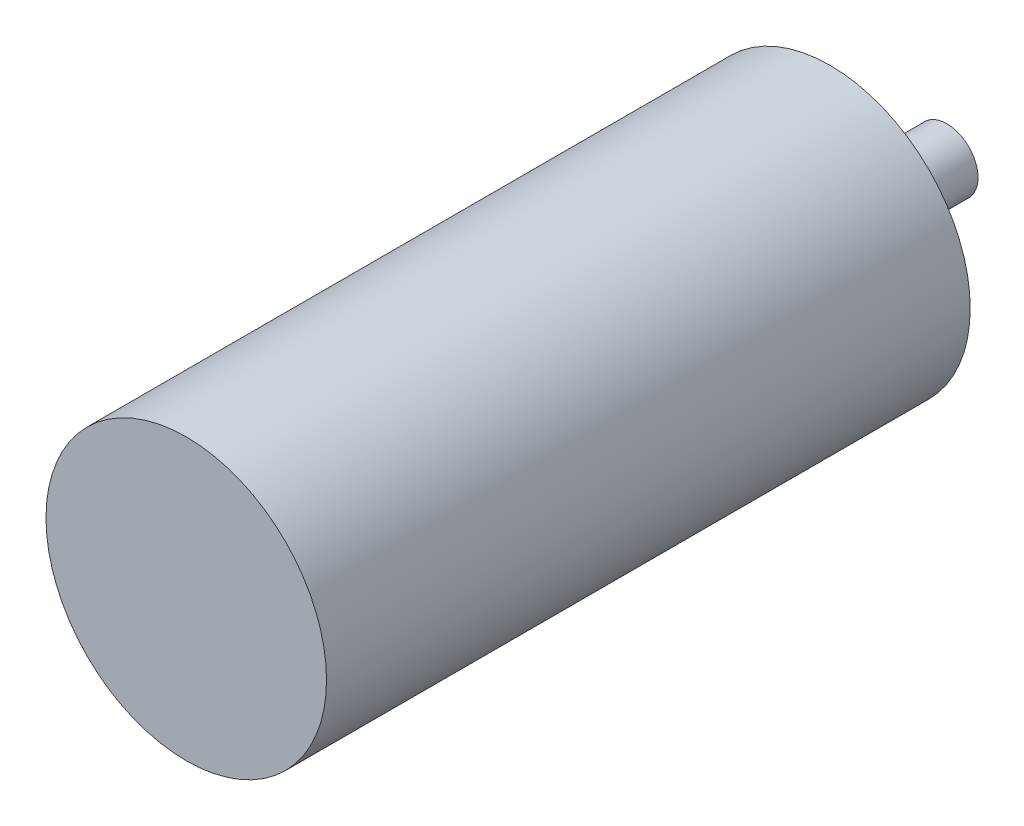
ISO-10303-21;
HEADER;
FILE_DESCRIPTION(('STEP AP214'),'2;1');
FILE_NAME('part.step','',(''),(''),'','','');
FILE_SCHEMA(('AUTOMOTIVE_DESIGN { 1 0 10303 214 1 1 1 1 }'));
ENDSEC;
DATA;
#1=APPLICATION_CONTEXT('core data for automotive mechanical design processes');
#2=APPLICATION_PROTOCOL_DEFINITION('international standard','automotive_design',2000,#1);
#3=PRODUCT_CONTEXT('',#1,'mechanical');
#4=PRODUCT('Part','Part','',(#3));
#5=PRODUCT_RELATED_PRODUCT_CATEGORY('part','',(#4));
#6=PRODUCT_DEFINITION_FORMATION('','',#4);
#7=PRODUCT_DEFINITION_CONTEXT('part definition',#1,'design');
#8=PRODUCT_DEFINITION('design','',#6,#7);
#9=PRODUCT_DEFINITION_SHAPE('','',#8);
#10=(LENGTH_UNIT() NAMED_UNIT(*) SI_UNIT(.MILLI.,.METRE.));
#11=(NAMED_UNIT(*) PLANE_ANGLE_UNIT() SI_UNIT($,.RADIAN.));
#12=(NAMED_UNIT(*) SI_UNIT($,.STERADIAN.) SOLID_ANGLE_UNIT());
#13=UNCERTAINTY_MEASURE_WITH_UNIT(LENGTH_MEASURE(1.E-05),#10,'distance_accuracy_value','');
#14=(GEOMETRIC_REPRESENTATION_CONTEXT(3) GLOBAL_UNCERTAINTY_ASSIGNED_CONTEXT((#13)) GLOBAL_UNIT_ASSIGNED_CONTEXT((#10,
#11,#12)) REPRESENTATION_CONTEXT('',''));
#15=CARTESIAN_POINT('',(0.,0.,0.));
#16=DIRECTION('',(0.,0.,1.));
#17=DIRECTION('',(1.,0.,0.));
#18=AXIS2_PLACEMENT_3D('',#15,#16,#17);
#19=CARTESIAN_POINT('',(0.,0.,82.6));
#20=DIRECTION('',(0.,0.,-1.));
#21=DIRECTION('',(-1.,0.,0.));
#22=AXIS2_PLACEMENT_3D('',#19,#20,#21);
#23=CYLINDRICAL_SURFACE('',#22,18.);
#24=CARTESIAN_POINT('',(0.,0.,82.6));
#25=DIRECTION('',(0.,0.,1.));
#26=DIRECTION('',(1.,0.,0.));
#27=AXIS2_PLACEMENT_3D('',#24,#25,#26);
#28=CIRCLE('',#27,18.);
#29=CARTESIAN_POINT('',(-18.,0.,82.6));
#30=VERTEX_POINT('',#29);
#31=EDGE_CURVE('E43',#30,#30,#28,.T.);
#32=CARTESIAN_POINT('',(0.,0.,0.));
#33=DIRECTION('',(0.,0.,1.));
#34=DIRECTION('',(1.,0.,0.));
#35=AXIS2_PLACEMENT_3D('',#32,#33,#34);
#36=CIRCLE('',#35,18.);
#37=CARTESIAN_POINT('',(-18.,0.,0.));
#38=VERTEX_POINT('',#37);
#39=EDGE_CURVE('E47',#38,#38,#36,.T.);
#40=CARTESIAN_POINT('',(-18.,0.,82.6));
#41=CARTESIAN_POINT('',(-18.,0.,81.7395833333333));
#42=CARTESIAN_POINT('',(-18.,0.,80.8791666666666));
#43=CARTESIAN_POINT('',(-18.,0.,79.1583333333333));
#44=CARTESIAN_POINT('',(-18.,0.,78.2979166666667));
#45=CARTESIAN_POINT('',(-18.,0.,76.5770833333333));
#46=CARTESIAN_POINT('',(-18.,0.,75.7166666666667));
#47=CARTESIAN_POINT('',(-18.,0.,73.9958333333333));
#48=CARTESIAN_POINT('',(-18.,0.,73.1354166666667));
#49=CARTESIAN_POINT('',(-18.,0.,71.4145833333333));
#50=CARTESIAN_POINT('',(-18.,0.,70.5541666666667));
#51=CARTESIAN_POINT('',(-18.,0.,68.8333333333333));
#52=CARTESIAN_POINT('',(-18.,0.,67.9729166666667));
#53=CARTESIAN_POINT('',(-18.,0.,66.2520833333333));
#54=CARTESIAN_POINT('',(-18.,0.,65.3916666666667));
#55=CARTESIAN_POINT('',(-18.,0.,63.6708333333333));
#56=CARTESIAN_POINT('',(-18.,0.,62.8104166666667));
#57=CARTESIAN_POINT('',(-18.,0.,61.0895833333333));
#58=CARTESIAN_POINT('',(-18.,0.,60.2291666666667));
#59=CARTESIAN_POINT('',(-18.,0.,58.5083333333333));
#60=CARTESIAN_POINT('',(-18.,0.,57.6479166666667));
#61=CARTESIAN_POINT('',(-18.,0.,55.9270833333333));
#62=CARTESIAN_POINT('',(-18.,0.,55.0666666666667));
#63=CARTESIAN_POINT('',(-18.,0.,53.3458333333333));
#64=CARTESIAN_POINT('',(-18.,0.,52.4854166666667));
#65=CARTESIAN_POINT('',(-18.,0.,50.7645833333333));
#66=CARTESIAN_POINT('',(-18.,0.,49.9041666666667));
#67=CARTESIAN_POINT('',(-18.,0.,48.1833333333333));
#68=CARTESIAN_POINT('',(-18.,0.,47.3229166666667));
#69=CARTESIAN_POINT('',(-18.,0.,45.6020833333333));
#70=CARTESIAN_POINT('',(-18.,0.,44.7416666666667));
#71=CARTESIAN_POINT('',(-18.,0.,43.0208333333333));
#72=CARTESIAN_POINT('',(-18.,0.,42.1604166666667));
#73=CARTESIAN_POINT('',(-18.,0.,40.4395833333333));
#74=CARTESIAN_POINT('',(-18.,0.,39.5791666666667));
#75=CARTESIAN_POINT('',(-18.,0.,37.8583333333333));
#76=CARTESIAN_POINT('',(-18.,0.,36.9979166666667));
#77=CARTESIAN_POINT('',(-18.,0.,35.2770833333333));
#78=CARTESIAN_POINT('',(-18.,0.,34.4166666666667));
#79=CARTESIAN_POINT('',(-18.,0.,32.6958333333333));
#80=CARTESIAN_POINT('',(-18.,0.,31.8354166666667));
#81=CARTESIAN_POINT('',(-18.,0.,30.1145833333333));
#82=CARTESIAN_POINT('',(-18.,0.,29.2541666666667));
#83=CARTESIAN_POINT('',(-18.,0.,27.5333333333333));
#84=CARTESIAN_POINT('',(-18.,0.,26.6729166666667));
#85=CARTESIAN_POINT('',(-18.,0.,24.9520833333333));
#86=CARTESIAN_POINT('',(-18.,0.,24.0916666666667));
#87=CARTESIAN_POINT('',(-18.,0.,22.3708333333333));
#88=CARTESIAN_POINT('',(-18.,0.,21.5104166666667));
#89=CARTESIAN_POINT('',(-18.,0.,19.7895833333333));
#90=CARTESIAN_POINT('',(-18.,0.,18.9291666666667));
#91=CARTESIAN_POINT('',(-18.,0.,17.2083333333333));
#92=CARTESIAN_POINT('',(-18.,0.,16.3479166666667));
#93=CARTESIAN_POINT('',(-18.,0.,14.6270833333333));
#94=CARTESIAN_POINT('',(-18.,0.,13.7666666666667));
#95=CARTESIAN_POINT('',(-18.,0.,12.0458333333333));
#96=CARTESIAN_POINT('',(-18.,0.,11.1854166666667));
#97=CARTESIAN_POINT('',(-18.,0.,9.46458333333333));
#98=CARTESIAN_POINT('',(-18.,0.,8.60416666666666));
#99=CARTESIAN_POINT('',(-18.,0.,6.88333333333333));
#100=CARTESIAN_POINT('',(-18.,0.,6.02291666666667));
#101=CARTESIAN_POINT('',(-18.,0.,4.30208333333334));
#102=CARTESIAN_POINT('',(-18.,0.,3.44166666666667));
#103=CARTESIAN_POINT('',(-18.,0.,1.72083333333334));
#104=CARTESIAN_POINT('',(-18.,0.,0.860416666666669));
#105=CARTESIAN_POINT('',(-18.,0.,0.));
#106=B_SPLINE_CURVE_WITH_KNOTS('',3,(#40,#41,#42,#43,#44,#45,#46,#47,#48,#49,#50,#51,#52,#53,
#54,#55,#56,#57,#58,#59,#60,#61,#62,#63,#64,#65,#66,#67,#68,#69,#70,#71,#72,#73,#74,#75,#76,#77,
#78,#79,#80,#81,#82,#83,#84,#85,#86,#87,#88,#89,#90,#91,#92,#93,#94,#95,#96,#97,#98,#99,#100,
#101,#102,#103,#104,#105),.UNSPECIFIED.,.F.,.F.,(4,2,2,2,2,2,2,2,2,2,2,2,2,2,2,2,2,2,2,2,2,2,2,
2,2,2,2,2,2,2,2,2,4),(0.,2.58125000000001,5.1625,7.74375000000001,10.325,12.90625,15.4875,
18.06875,20.65,23.23125,25.8125,28.39375,30.975,33.55625,36.1375,38.71875,41.3,43.88125,46.4625,
49.04375,51.625,54.20625,56.7875,59.36875,61.95,64.53125,67.1125,69.69375,72.275,74.85625,
77.4375,80.01875,82.6),.UNSPECIFIED.);
#107=EDGE_CURVE('BSEAM37',#30,#38,#106,.T.);
#108=ORIENTED_EDGE('',*,*,#31,.F.);
#109=ORIENTED_EDGE('',*,*,#39,.T.);
#110=ORIENTED_EDGE('',*,*,#107,.T.);
#111=ORIENTED_EDGE('',*,*,#107,.F.);
#112=EDGE_LOOP('',(#108,#110,#109,#111));
#113=FACE_BOUND('',#112,.T.);
#114=ADVANCED_FACE('F37',(#113),#23,.T.);
#115=CARTESIAN_POINT('',(0.,0.,82.6));
#116=DIRECTION('',(0.,0.,1.));
#117=DIRECTION('',(1.,0.,0.));
#118=AXIS2_PLACEMENT_3D('',#115,#116,#117);
#119=PLANE('',#118);
#120=ORIENTED_EDGE('',*,*,#31,.T.);
#121=EDGE_LOOP('',(#120));
#122=FACE_BOUND('',#121,.T.);
#123=ADVANCED_FACE('F97',(#122),#119,.T.);
#124=CARTESIAN_POINT('',(0.,0.,0.));
#125=DIRECTION('',(0.,0.,1.));
#126=DIRECTION('',(1.,0.,0.));
#127=AXIS2_PLACEMENT_3D('',#124,#125,#126);
#128=PLANE('',#127);
#129=CARTESIAN_POINT('',(0.,0.,0.));
#130=DIRECTION('',(0.,0.,1.));
#131=DIRECTION('',(1.,0.,0.));
#132=AXIS2_PLACEMENT_3D('',#129,#130,#131);
#133=CIRCLE('',#132,4.);
#134=CARTESIAN_POINT('',(4.,0.,0.));
#135=VERTEX_POINT('',#134);
#136=EDGE_CURVE('E10',#135,#135,#133,.F.);
#137=ORIENTED_EDGE('',*,*,#136,.F.);
#138=EDGE_LOOP('',(#137));
#139=FACE_BOUND('',#138,.T.);
#140=CARTESIAN_POINT('',(0.,14.,0.));
#141=DIRECTION('',(0.,0.,-1.));
#142=DIRECTION('',(-1.,0.,0.));
#143=AXIS2_PLACEMENT_3D('',#140,#141,#142);
#144=CIRCLE('',#143,1.5);
#145=CARTESIAN_POINT('',(-1.5,14.,0.));
#146=VERTEX_POINT('',#145);
#147=EDGE_CURVE('E73',#146,#146,#144,.T.);
#148=ORIENTED_EDGE('',*,*,#147,.F.);
#149=EDGE_LOOP('',(#148));
#150=FACE_BOUND('',#149,.T.);
#151=CARTESIAN_POINT('',(-14.,0.,0.));
#152=DIRECTION('',(0.,0.,-1.));
#153=DIRECTION('',(-1.,0.,0.));
#154=AXIS2_PLACEMENT_3D('',#151,#152,#153);
#155=CIRCLE('',#154,1.5);
#156=CARTESIAN_POINT('',(-15.5,0.,0.));
#157=VERTEX_POINT('',#156);
#158=EDGE_CURVE('E70',#157,#157,#155,.T.);
#159=ORIENTED_EDGE('',*,*,#158,.F.);
#160=EDGE_LOOP('',(#159));
#161=FACE_BOUND('',#160,.T.);
#162=CARTESIAN_POINT('',(0.,-14.,0.));
#163=DIRECTION('',(0.,0.,-1.));
#164=DIRECTION('',(-1.,0.,0.));
#165=AXIS2_PLACEMENT_3D('',#162,#163,#164);
#166=CIRCLE('',#165,1.5);
#167=CARTESIAN_POINT('',(-1.5,-14.,0.));
#168=VERTEX_POINT('',#167);
#169=EDGE_CURVE('E64',#168,#168,#166,.T.);
#170=ORIENTED_EDGE('',*,*,#169,.F.);
#171=EDGE_LOOP('',(#170));
#172=FACE_BOUND('',#171,.T.);
#173=CARTESIAN_POINT('',(14.,0.,0.));
#174=DIRECTION('',(0.,0.,-1.));
#175=DIRECTION('',(-1.,0.,0.));
#176=AXIS2_PLACEMENT_3D('',#173,#174,#175);
#177=CIRCLE('',#176,1.5);
#178=CARTESIAN_POINT('',(12.5,0.,0.));
#179=VERTEX_POINT('',#178);
#180=EDGE_CURVE('E57',#179,#179,#177,.T.);
#181=ORIENTED_EDGE('',*,*,#180,.F.);
#182=EDGE_LOOP('',(#181));
#183=FACE_BOUND('',#182,.T.);
#184=ORIENTED_EDGE('',*,*,#39,.F.);
#185=EDGE_LOOP('',(#184));
#186=FACE_BOUND('',#185,.T.);
#187=ADVANCED_FACE('F102',(#139,#150,#161,#172,#183,#186),#128,.F.);
#188=CARTESIAN_POINT('',(14.,0.,5.));
#189=DIRECTION('',(0.,0.,-1.));
#190=DIRECTION('',(-1.,0.,0.));
#191=AXIS2_PLACEMENT_3D('',#188,#189,#190);
#192=CYLINDRICAL_SURFACE('',#191,1.5);
#193=CARTESIAN_POINT('',(14.,0.,5.));
#194=DIRECTION('',(0.,0.,-1.));
#195=DIRECTION('',(-1.,0.,0.));
#196=AXIS2_PLACEMENT_3D('',#193,#194,#195);
#197=CIRCLE('',#196,1.5);
#198=CARTESIAN_POINT('',(12.5,0.,5.));
#199=VERTEX_POINT('',#198);
#200=EDGE_CURVE('E54',#199,#199,#197,.T.);
#201=ORIENTED_EDGE('',*,*,#200,.F.);
#202=EDGE_LOOP('',(#201));
#203=FACE_BOUND('',#202,.T.);
#204=ORIENTED_EDGE('',*,*,#180,.T.);
#205=EDGE_LOOP('',(#204));
#206=FACE_BOUND('',#205,.T.);
#207=ADVANCED_FACE('F107',(#203,#206),#192,.F.);
#208=CARTESIAN_POINT('',(14.,0.,5.));
#209=DIRECTION('',(0.,0.,-1.));
#210=DIRECTION('',(-1.,0.,0.));
#211=AXIS2_PLACEMENT_3D('',#208,#209,#210);
#212=PLANE('',#211);
#213=ORIENTED_EDGE('',*,*,#200,.T.);
#214=EDGE_LOOP('',(#213));
#215=FACE_BOUND('',#214,.T.);
#216=ADVANCED_FACE('F112',(#215),#212,.T.);
#217=CARTESIAN_POINT('',(0.,-14.,5.));
#218=DIRECTION('',(0.,0.,-1.));
#219=DIRECTION('',(-1.,0.,0.));
#220=AXIS2_PLACEMENT_3D('',#217,#218,#219);
#221=CYLINDRICAL_SURFACE('',#220,1.5);
#222=CARTESIAN_POINT('',(0.,-14.,5.));
#223=DIRECTION('',(0.,0.,-1.));
#224=DIRECTION('',(-1.,0.,0.));
#225=AXIS2_PLACEMENT_3D('',#222,#223,#224);
#226=CIRCLE('',#225,1.5);
#227=CARTESIAN_POINT('',(-1.5,-14.,5.));
#228=VERTEX_POINT('',#227);
#229=EDGE_CURVE('E61',#228,#228,#226,.T.);
#230=ORIENTED_EDGE('',*,*,#229,.F.);
#231=EDGE_LOOP('',(#230));
#232=FACE_BOUND('',#231,.T.);
#233=ORIENTED_EDGE('',*,*,#169,.T.);
#234=EDGE_LOOP('',(#233));
#235=FACE_BOUND('',#234,.T.);
#236=ADVANCED_FACE('F118',(#232,#235),#221,.F.);
#237=CARTESIAN_POINT('',(0.,-14.,5.));
#238=DIRECTION('',(0.,0.,-1.));
#239=DIRECTION('',(-1.,0.,0.));
#240=AXIS2_PLACEMENT_3D('',#237,#238,#239);
#241=PLANE('',#240);
#242=ORIENTED_EDGE('',*,*,#229,.T.);
#243=EDGE_LOOP('',(#242));
#244=FACE_BOUND('',#243,.T.);
#245=ADVANCED_FACE('F121',(#244),#241,.T.);
#246=CARTESIAN_POINT('',(-14.,0.,5.));
#247=DIRECTION('',(0.,0.,-1.));
#248=DIRECTION('',(-1.,0.,0.));
#249=AXIS2_PLACEMENT_3D('',#246,#247,#248);
#250=CYLINDRICAL_SURFACE('',#249,1.5);
#251=CARTESIAN_POINT('',(-14.,0.,5.));
#252=DIRECTION('',(0.,0.,-1.));
#253=DIRECTION('',(-1.,0.,0.));
#254=AXIS2_PLACEMENT_3D('',#251,#252,#253);
#255=CIRCLE('',#254,1.5);
#256=CARTESIAN_POINT('',(-15.5,0.,5.));
#257=VERTEX_POINT('',#256);
#258=EDGE_CURVE('E67',#257,#257,#255,.T.);
#259=ORIENTED_EDGE('',*,*,#258,.F.);
#260=EDGE_LOOP('',(#259));
#261=FACE_BOUND('',#260,.T.);
#262=ORIENTED_EDGE('',*,*,#158,.T.);
#263=EDGE_LOOP('',(#262));
#264=FACE_BOUND('',#263,.T.);
#265=ADVANCED_FACE('F124',(#261,#264),#250,.F.);
#266=CARTESIAN_POINT('',(-14.,0.,5.));
#267=DIRECTION('',(0.,0.,-1.));
#268=DIRECTION('',(-1.,0.,0.));
#269=AXIS2_PLACEMENT_3D('',#266,#267,#268);
#270=PLANE('',#269);
#271=ORIENTED_EDGE('',*,*,#258,.T.);
#272=EDGE_LOOP('',(#271));
#273=FACE_BOUND('',#272,.T.);
#274=ADVANCED_FACE('F129',(#273),#270,.T.);
#275=CARTESIAN_POINT('',(0.,14.,5.));
#276=DIRECTION('',(0.,0.,-1.));
#277=DIRECTION('',(-1.,0.,0.));
#278=AXIS2_PLACEMENT_3D('',#275,#276,#277);
#279=CYLINDRICAL_SURFACE('',#278,1.5);
#280=CARTESIAN_POINT('',(0.,14.,5.));
#281=DIRECTION('',(0.,0.,-1.));
#282=DIRECTION('',(-1.,0.,0.));
#283=AXIS2_PLACEMENT_3D('',#280,#281,#282);
#284=CIRCLE('',#283,1.5);
#285=CARTESIAN_POINT('',(-1.5,14.,5.));
#286=VERTEX_POINT('',#285);
#287=EDGE_CURVE('E52',#286,#286,#284,.T.);
#288=ORIENTED_EDGE('',*,*,#287,.F.);
#289=EDGE_LOOP('',(#288));
#290=FACE_BOUND('',#289,.T.);
#291=ORIENTED_EDGE('',*,*,#147,.T.);
#292=EDGE_LOOP('',(#291));
#293=FACE_BOUND('',#292,.T.);
#294=ADVANCED_FACE('F93',(#290,#293),#279,.F.);
#295=CARTESIAN_POINT('',(0.,14.,5.));
#296=DIRECTION('',(0.,0.,-1.));
#297=DIRECTION('',(-1.,0.,0.));
#298=AXIS2_PLACEMENT_3D('',#295,#296,#297);
#299=PLANE('',#298);
#300=ORIENTED_EDGE('',*,*,#287,.T.);
#301=EDGE_LOOP('',(#300));
#302=FACE_BOUND('',#301,.T.);
#303=ADVANCED_FACE('F85',(#302),#299,.T.);
#304=CARTESIAN_POINT('',(0.,0.,-15.));
#305=DIRECTION('',(0.,0.,1.));
#306=DIRECTION('',(1.,0.,0.));
#307=AXIS2_PLACEMENT_3D('',#304,#305,#306);
#308=CYLINDRICAL_SURFACE('',#307,4.);
#309=CARTESIAN_POINT('',(0.,0.,-15.));
#310=DIRECTION('',(0.,0.,-1.));
#311=DIRECTION('',(-1.,0.,0.));
#312=AXIS2_PLACEMENT_3D('',#309,#310,#311);
#313=CIRCLE('',#312,4.);
#314=CARTESIAN_POINT('',(-4.,0.,-15.));
#315=VERTEX_POINT('',#314);
#316=EDGE_CURVE('E58',#315,#315,#313,.T.);
#317=ORIENTED_EDGE('',*,*,#316,.F.);
#318=EDGE_LOOP('',(#317));
#319=FACE_BOUND('',#318,.T.);
#320=ORIENTED_EDGE('',*,*,#136,.T.);
#321=EDGE_LOOP('',(#320));
#322=FACE_BOUND('',#321,.T.);
#323=ADVANCED_FACE('F83',(#319,#322),#308,.T.);
#324=CARTESIAN_POINT('',(0.,0.,-15.));
#325=DIRECTION('',(0.,0.,-1.));
#326=DIRECTION('',(-1.,0.,0.));
#327=AXIS2_PLACEMENT_3D('',#324,#325,#326);
#328=PLANE('',#327);
#329=ORIENTED_EDGE('',*,*,#316,.T.);
#330=EDGE_LOOP('',(#329));
#331=FACE_BOUND('',#330,.T.);
#332=ADVANCED_FACE('F81',(#331),#328,.T.);
#333=CLOSED_SHELL('',(#114,#123,#187,#207,#216,#236,#245,#265,#274,#294,#303,#323,#332));
#334=MANIFOLD_SOLID_BREP('B2',#333);
#335=ADVANCED_BREP_SHAPE_REPRESENTATION('',(#18,#334),#14);
#336=SHAPE_DEFINITION_REPRESENTATION(#9,#335);
ENDSEC;
END-ISO-10303-21;
